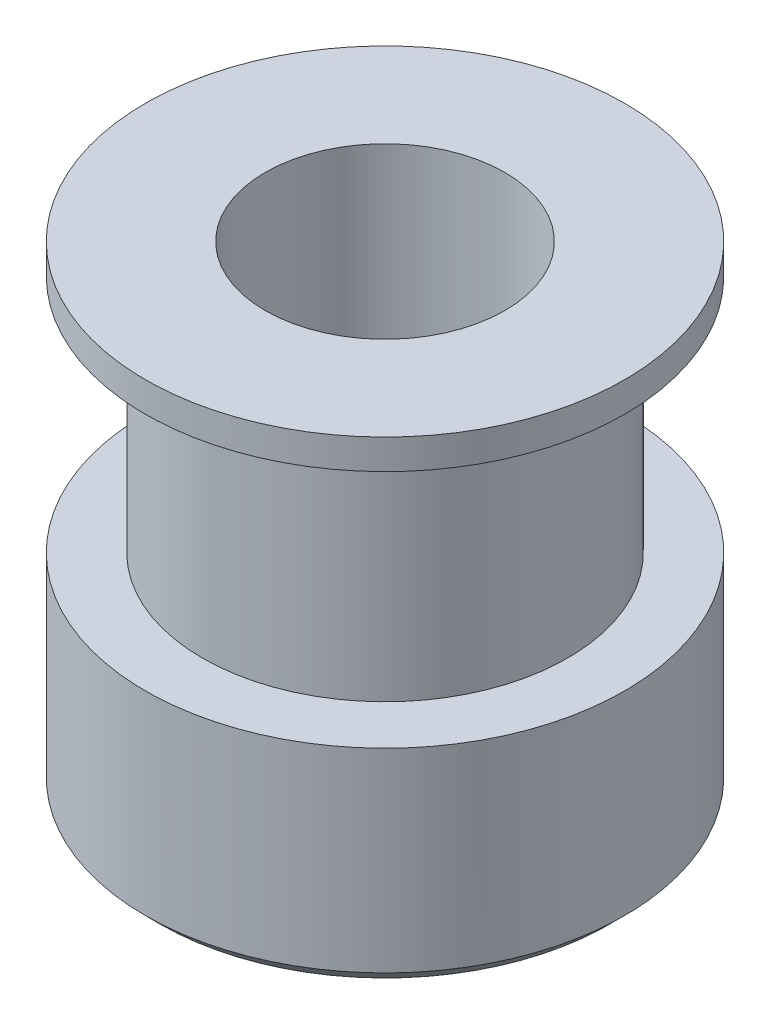
ISO-10303-21;
HEADER;
FILE_DESCRIPTION(('STEP AP214'),'2;1');
FILE_NAME('part.step','',(''),(''),'','','');
FILE_SCHEMA(('AUTOMOTIVE_DESIGN { 1 0 10303 214 1 1 1 1 }'));
ENDSEC;
DATA;
#1=APPLICATION_CONTEXT('core data for automotive mechanical design processes');
#2=APPLICATION_PROTOCOL_DEFINITION('international standard','automotive_design',2000,#1);
#3=PRODUCT_CONTEXT('',#1,'mechanical');
#4=PRODUCT('Part','Part','',(#3));
#5=PRODUCT_RELATED_PRODUCT_CATEGORY('part','',(#4));
#6=PRODUCT_DEFINITION_FORMATION('','',#4);
#7=PRODUCT_DEFINITION_CONTEXT('part definition',#1,'design');
#8=PRODUCT_DEFINITION('design','',#6,#7);
#9=PRODUCT_DEFINITION_SHAPE('','',#8);
#10=(LENGTH_UNIT() NAMED_UNIT(*) SI_UNIT(.MILLI.,.METRE.));
#11=(NAMED_UNIT(*) PLANE_ANGLE_UNIT() SI_UNIT($,.RADIAN.));
#12=(NAMED_UNIT(*) SI_UNIT($,.STERADIAN.) SOLID_ANGLE_UNIT());
#13=UNCERTAINTY_MEASURE_WITH_UNIT(LENGTH_MEASURE(1.E-05),#10,'distance_accuracy_value','');
#14=(GEOMETRIC_REPRESENTATION_CONTEXT(3) GLOBAL_UNCERTAINTY_ASSIGNED_CONTEXT((#13)) GLOBAL_UNIT_ASSIGNED_CONTEXT((#10,
#11,#12)) REPRESENTATION_CONTEXT('',''));
#15=CARTESIAN_POINT('',(0.,0.,0.));
#16=DIRECTION('',(0.,0.,1.));
#17=DIRECTION('',(1.,0.,0.));
#18=AXIS2_PLACEMENT_3D('',#15,#16,#17);
#19=CARTESIAN_POINT('',(-8.,0.,0.));
#20=DIRECTION('',(0.,1.,0.));
#21=DIRECTION('',(0.,0.,1.));
#22=AXIS2_PLACEMENT_3D('',#19,#20,#21);
#23=PLANE('',#22);
#24=CARTESIAN_POINT('',(0.,0.,0.));
#25=DIRECTION('',(0.,1.,0.));
#26=DIRECTION('',(0.,0.,1.));
#27=AXIS2_PLACEMENT_3D('',#24,#25,#26);
#28=CIRCLE('',#27,7.50000000000001);
#29=CARTESIAN_POINT('',(0.,0.,7.50000000000001));
#30=VERTEX_POINT('',#29);
#31=EDGE_CURVE('E37',#30,#30,#28,.F.);
#32=ORIENTED_EDGE('',*,*,#31,.T.);
#33=EDGE_LOOP('',(#32));
#34=FACE_BOUND('',#33,.T.);
#35=CARTESIAN_POINT('',(0.,0.,0.));
#36=DIRECTION('',(0.,-1.,0.));
#37=DIRECTION('',(0.,0.,-1.));
#38=AXIS2_PLACEMENT_3D('',#35,#36,#37);
#39=CIRCLE('',#38,4.);
#40=CARTESIAN_POINT('',(0.,0.,-4.));
#41=VERTEX_POINT('',#40);
#42=EDGE_CURVE('E41',#41,#41,#39,.T.);
#43=ORIENTED_EDGE('',*,*,#42,.F.);
#44=EDGE_LOOP('',(#43));
#45=FACE_BOUND('',#44,.T.);
#46=ADVANCED_FACE('F30',(#34,#45),#23,.F.);
#47=CARTESIAN_POINT('',(0.,0.,0.));
#48=DIRECTION('',(0.,-1.,0.));
#49=DIRECTION('',(0.,0.,-1.));
#50=AXIS2_PLACEMENT_3D('',#47,#48,#49);
#51=CYLINDRICAL_SURFACE('',#50,4.);
#52=CARTESIAN_POINT('',(-3.70809924354783,3.5,-1.5));
#53=CARTESIAN_POINT('',(-3.70809640633806,3.58100748372079,-1.50000304106109));
#54=CARTESIAN_POINT('',(-3.71078260240986,3.66199492250364,-1.49341597549487));
#55=CARTESIAN_POINT('',(-3.72116159304967,3.8215280829132,-1.46736187895468));
#56=CARTESIAN_POINT('',(-3.72885423767112,3.90007387759501,-1.44789523373263));
#57=CARTESIAN_POINT('',(-3.748254802809,4.05237537161353,-1.39689657610574));
#58=CARTESIAN_POINT('',(-3.7599530956926,4.12614205665108,-1.36539347266348));
#59=CARTESIAN_POINT('',(-3.78603134206598,4.26737189681884,-1.29131856742698));
#60=CARTESIAN_POINT('',(-3.80041210067323,4.33483315028252,-1.24874344095039));
#61=CARTESIAN_POINT('',(-3.83103574665713,4.46489031162282,-1.15146661374162));
#62=CARTESIAN_POINT('',(-3.84733341923603,4.52712852962939,-1.09630381213306));
#63=CARTESIAN_POINT('',(-3.87949750628547,4.64172281467149,-0.976395839778925));
#64=CARTESIAN_POINT('',(-3.89536382814785,4.69407677374185,-0.911648630256679));
#65=CARTESIAN_POINT('',(-3.92552873936553,4.78913951229561,-0.7716946551776));
#66=CARTESIAN_POINT('',(-3.93975561223505,4.83145947471586,-0.696206947538027));
#67=CARTESIAN_POINT('',(-3.96438007973848,4.90265117252491,-0.538555771965246));
#68=CARTESIAN_POINT('',(-3.97477900217006,4.93152757199197,-0.456394630933535));
#69=CARTESIAN_POINT('',(-3.9901869710344,4.97375789577462,-0.291489341676831));
#70=CARTESIAN_POINT('',(-3.99540915214774,4.98772762744046,-0.208923197281595));
#71=CARTESIAN_POINT('',(-4.0006401410794,5.00172120094499,-0.042464363794785));
#72=CARTESIAN_POINT('',(-4.00065064414902,5.00174957761871,0.0414278850628338));
#73=CARTESIAN_POINT('',(-3.99559265903894,4.98821823853483,0.203743543064477));
#74=CARTESIAN_POINT('',(-3.99077541996683,4.97533070205118,0.282232178266901));
#75=CARTESIAN_POINT('',(-3.97693274932263,4.93746408477445,0.435839217984392));
#76=CARTESIAN_POINT('',(-3.96790701975577,4.91248414773796,0.510957383430299));
#77=CARTESIAN_POINT('',(-3.9463776916753,4.85082954832415,0.656989017303105));
#78=CARTESIAN_POINT('',(-3.93382539470077,4.81398999473159,0.72782539228731));
#79=CARTESIAN_POINT('',(-3.90651310225279,4.72980790307061,0.86248660795756));
#80=CARTESIAN_POINT('',(-3.8917523951284,4.6824619769824,0.926309176932323));
#81=CARTESIAN_POINT('',(-3.86052529655816,4.57537271371681,1.04909048680094));
#82=CARTESIAN_POINT('',(-3.84400963763883,4.51506608434957,1.10754614526348));
#83=CARTESIAN_POINT('',(-3.81182460645722,4.38540700667844,1.21370395569342));
#84=CARTESIAN_POINT('',(-3.79615544748847,4.31605229341336,1.261403406929));
#85=CARTESIAN_POINT('',(-3.76712703500335,4.16828053253717,1.34565611808152));
#86=CARTESIAN_POINT('',(-3.75382677150277,4.08969650631393,1.38193847851831));
#87=CARTESIAN_POINT('',(-3.73172438629002,3.92690377483242,1.44056464441501));
#88=CARTESIAN_POINT('',(-3.72291976205783,3.84269822840631,1.46291620605595));
#89=CARTESIAN_POINT('',(-3.71139597222848,3.67602403768404,1.49190191709668));
#90=CARTESIAN_POINT('',(-3.70836785241537,3.59371589446386,1.49933521158966));
#91=CARTESIAN_POINT('',(-3.70786539525016,3.42899064325826,1.50057885636272));
#92=CARTESIAN_POINT('',(-3.71038967003987,3.34657356764753,1.49439261093762));
#93=CARTESIAN_POINT('',(-3.72039381629735,3.18807007771232,1.46929733520157));
#94=CARTESIAN_POINT('',(-3.72763276216449,3.11186886423534,1.45100618334225));
#95=CARTESIAN_POINT('',(-3.74596487046362,2.9636520552798,1.40299774640637));
#96=CARTESIAN_POINT('',(-3.75705882250173,2.89163732083186,1.37327812034623));
#97=CARTESIAN_POINT('',(-3.7823624311608,2.75083556192379,1.30200292275278));
#98=CARTESIAN_POINT('',(-3.79667328892065,2.68227070786266,1.26004545177047));
#99=CARTESIAN_POINT('',(-3.82662814294291,2.55287101827396,1.16591317862479));
#100=CARTESIAN_POINT('',(-3.84227262594077,2.49203902537537,1.11373463696435));
#101=CARTESIAN_POINT('',(-3.87433046553184,2.3758316268049,0.996727340900938));
#102=CARTESIAN_POINT('',(-3.89072969357028,2.32104659123125,0.931306341491061));
#103=CARTESIAN_POINT('',(-3.92149874963302,2.22316163241056,0.79179747175315));
#104=CARTESIAN_POINT('',(-3.93586857107664,2.18006174705416,0.717709573322673));
#105=CARTESIAN_POINT('',(-3.96094985704552,2.10705394380039,0.563016329468476));
#106=CARTESIAN_POINT('',(-3.9716738133801,2.0771008762074,0.482434433064626));
#107=CARTESIAN_POINT('',(-3.98829436712571,2.03134358615008,0.316881887523254));
#108=CARTESIAN_POINT('',(-3.99419323299412,2.0155327145776,0.231913320723592));
#109=CARTESIAN_POINT('',(-4.00028407317073,1.99922559724517,0.0653355852738148));
#110=CARTESIAN_POINT('',(-4.00078860953764,1.99789051694101,-0.0161807680608461));
#111=CARTESIAN_POINT('',(-3.99684889809223,2.00841515944539,-0.178226786412425));
#112=CARTESIAN_POINT('',(-3.9924052471313,2.02027329088586,-0.258756569245258));
#113=CARTESIAN_POINT('',(-3.97921089603771,2.05625885149362,-0.414548248377127));
#114=CARTESIAN_POINT('',(-3.97056791378017,2.08007990587836,-0.489890731068835));
#115=CARTESIAN_POINT('',(-3.9498778362099,2.13901001338436,-0.63551547300639));
#116=CARTESIAN_POINT('',(-3.93783009655664,2.17412120330475,-0.705796771275543));
#117=CARTESIAN_POINT('',(-3.91090618300074,2.25631394350481,-0.842540176994413));
#118=CARTESIAN_POINT('',(-3.89593240108828,2.30383664051415,-0.90871754884685));
#119=CARTESIAN_POINT('',(-3.86499507694844,2.4088078301876,-1.03241734752336));
#120=CARTESIAN_POINT('',(-3.84903118274027,2.46625986580787,-1.0899366712559));
#121=CARTESIAN_POINT('',(-3.81688129739175,2.59306413164506,-1.19781214236196));
#122=CARTESIAN_POINT('',(-3.8007280534916,2.66288440215431,-1.24762999816025));
#123=CARTESIAN_POINT('',(-3.77098325003638,2.81041586957332,-1.33484709556843));
#124=CARTESIAN_POINT('',(-3.75739195631216,2.88812788405348,-1.37224504878157));
#125=CARTESIAN_POINT('',(-3.73402269853266,3.0529556809754,-1.4346588697426));
#126=CARTESIAN_POINT('',(-3.7244380329086,3.14033436651178,-1.45906002899523));
#127=CARTESIAN_POINT('',(-3.71147994336315,3.31848527195579,-1.49172356722079));
#128=CARTESIAN_POINT('',(-3.70810242179736,3.40925521270999,-1.49999659339571));
#129=CARTESIAN_POINT('',(-3.70809924354783,3.5,-1.5));
#130=B_SPLINE_CURVE_WITH_KNOTS('',3,(#52,#53,#54,#55,#56,#57,#58,#59,#60,#61,#62,#63,#64,#65,
#66,#67,#68,#69,#70,#71,#72,#73,#74,#75,#76,#77,#78,#79,#80,#81,#82,#83,#84,#85,#86,#87,#88,#89,
#90,#91,#92,#93,#94,#95,#96,#97,#98,#99,#100,#101,#102,#103,#104,#105,#106,#107,#108,#109,#110,
#111,#112,#113,#114,#115,#116,#117,#118,#119,#120,#121,#122,#123,#124,#125,#126,#127,#128,#129),
.UNSPECIFIED.,.T.,.F.,(4,2,2,2,2,2,2,2,2,2,2,2,2,2,2,2,2,2,2,2,2,2,2,2,2,2,2,2,2,2,2,2,2,2,2,2,
2,2,4),(0.,0.242684541416171,0.485361814598855,0.72745985675703,0.969630679682933,
1.22274652401128,1.47591628822983,1.73770072136421,1.9993942638133,2.24980018489679,
2.50012465404857,2.73806472803194,2.97602165263335,3.21744131210668,3.45893893628976,
3.71456675065875,3.97025867827335,4.23162592252967,4.49284751635474,4.73965657740485,
4.98640395388884,5.22143845928199,5.45652113429526,5.70041561005822,5.94439948466355,
6.20385016993624,6.46330169650178,6.72185508890168,6.98028685560127,7.22365720549936,
7.4669982031948,7.70440274003891,7.94185223512831,8.18928323676987,8.43680270894965,
8.69738599542079,8.95799630544242,9.23003178870926,9.50188762323053),.UNSPECIFIED.);
#131=CARTESIAN_POINT('',(-3.70809924354783,3.5,-1.5));
#132=VERTEX_POINT('',#131);
#133=EDGE_CURVE('E95',#132,#132,#130,.T.);
#134=ORIENTED_EDGE('',*,*,#133,.F.);
#135=EDGE_LOOP('',(#134));
#136=FACE_BOUND('',#135,.T.);
#137=CARTESIAN_POINT('',(1.5,3.5,-3.70809924354783));
#138=CARTESIAN_POINT('',(1.50000304106109,3.58100748372079,-3.70809640633806));
#139=CARTESIAN_POINT('',(1.49341597549487,3.66199492250364,-3.71078260240986));
#140=CARTESIAN_POINT('',(1.46736187895468,3.8215280829132,-3.72116159304967));
#141=CARTESIAN_POINT('',(1.44789523373263,3.90007387759501,-3.72885423767112));
#142=CARTESIAN_POINT('',(1.39689657610574,4.05237537161353,-3.748254802809));
#143=CARTESIAN_POINT('',(1.36539347266348,4.12614205665108,-3.7599530956926));
#144=CARTESIAN_POINT('',(1.29131856742698,4.26737189681884,-3.78603134206598));
#145=CARTESIAN_POINT('',(1.24874344095039,4.33483315028252,-3.80041210067323));
#146=CARTESIAN_POINT('',(1.15146661374162,4.46489031162282,-3.83103574665713));
#147=CARTESIAN_POINT('',(1.09630381213306,4.52712852962939,-3.84733341923603));
#148=CARTESIAN_POINT('',(0.976395839778926,4.64172281467149,-3.87949750628547));
#149=CARTESIAN_POINT('',(0.911648630256679,4.69407677374186,-3.89536382814785));
#150=CARTESIAN_POINT('',(0.7716946551776,4.78913951229561,-3.92552873936553));
#151=CARTESIAN_POINT('',(0.696206947538027,4.83145947471586,-3.93975561223505));
#152=CARTESIAN_POINT('',(0.538555771965246,4.90265117252491,-3.96438007973848));
#153=CARTESIAN_POINT('',(0.456394630933535,4.93152757199198,-3.97477900217006));
#154=CARTESIAN_POINT('',(0.291489341676831,4.97375789577462,-3.9901869710344));
#155=CARTESIAN_POINT('',(0.208923197281595,4.98772762744046,-3.99540915214774));
#156=CARTESIAN_POINT('',(0.0424643637947852,5.00172120094499,-4.0006401410794));
#157=CARTESIAN_POINT('',(-0.0414278850628338,5.00174957761871,-4.00065064414902));
#158=CARTESIAN_POINT('',(-0.203743543064477,4.98821823853483,-3.99559265903894));
#159=CARTESIAN_POINT('',(-0.282232178266901,4.97533070205119,-3.99077541996683));
#160=CARTESIAN_POINT('',(-0.435839217984392,4.93746408477445,-3.97693274932263));
#161=CARTESIAN_POINT('',(-0.510957383430299,4.91248414773796,-3.96790701975577));
#162=CARTESIAN_POINT('',(-0.656989017303105,4.85082954832415,-3.9463776916753));
#163=CARTESIAN_POINT('',(-0.72782539228731,4.81398999473159,-3.93382539470077));
#164=CARTESIAN_POINT('',(-0.86248660795756,4.72980790307061,-3.90651310225279));
#165=CARTESIAN_POINT('',(-0.926309176932323,4.6824619769824,-3.8917523951284));
#166=CARTESIAN_POINT('',(-1.04909048680094,4.57537271371681,-3.86052529655816));
#167=CARTESIAN_POINT('',(-1.10754614526348,4.51506608434957,-3.84400963763883));
#168=CARTESIAN_POINT('',(-1.21370395569342,4.38540700667844,-3.81182460645722));
#169=CARTESIAN_POINT('',(-1.261403406929,4.31605229341336,-3.79615544748847));
#170=CARTESIAN_POINT('',(-1.34565611808152,4.16828053253718,-3.76712703500335));
#171=CARTESIAN_POINT('',(-1.38193847851831,4.08969650631393,-3.75382677150277));
#172=CARTESIAN_POINT('',(-1.44056464441501,3.92690377483243,-3.73172438629002));
#173=CARTESIAN_POINT('',(-1.46291620605595,3.84269822840631,-3.72291976205783));
#174=CARTESIAN_POINT('',(-1.49190191709668,3.67602403768405,-3.71139597222848));
#175=CARTESIAN_POINT('',(-1.49933521158966,3.59371589446386,-3.70836785241537));
#176=CARTESIAN_POINT('',(-1.50057885636272,3.42899064325826,-3.70786539525016));
#177=CARTESIAN_POINT('',(-1.49439261093762,3.34657356764753,-3.71038967003987));
#178=CARTESIAN_POINT('',(-1.46929733520157,3.18807007771232,-3.72039381629735));
#179=CARTESIAN_POINT('',(-1.45100618334224,3.11186886423534,-3.72763276216449));
#180=CARTESIAN_POINT('',(-1.40299774640637,2.96365205527981,-3.74596487046362));
#181=CARTESIAN_POINT('',(-1.37327812034623,2.89163732083186,-3.75705882250173));
#182=CARTESIAN_POINT('',(-1.30200292275278,2.75083556192379,-3.7823624311608));
#183=CARTESIAN_POINT('',(-1.26004545177047,2.68227070786266,-3.79667328892065));
#184=CARTESIAN_POINT('',(-1.16591317862479,2.55287101827396,-3.82662814294291));
#185=CARTESIAN_POINT('',(-1.11373463696434,2.49203902537537,-3.84227262594077));
#186=CARTESIAN_POINT('',(-0.996727340900936,2.3758316268049,-3.87433046553184));
#187=CARTESIAN_POINT('',(-0.93130634149106,2.32104659123125,-3.89072969357028));
#188=CARTESIAN_POINT('',(-0.791797471753149,2.22316163241056,-3.92149874963302));
#189=CARTESIAN_POINT('',(-0.717709573322671,2.18006174705416,-3.93586857107664));
#190=CARTESIAN_POINT('',(-0.563016329468475,2.10705394380039,-3.96094985704552));
#191=CARTESIAN_POINT('',(-0.482434433064625,2.0771008762074,-3.9716738133801));
#192=CARTESIAN_POINT('',(-0.316881887523253,2.03134358615008,-3.98829436712571));
#193=CARTESIAN_POINT('',(-0.231913320723591,2.0155327145776,-3.99419323299413));
#194=CARTESIAN_POINT('',(-0.0653355852738134,1.99922559724518,-4.00028407317073));
#195=CARTESIAN_POINT('',(0.0161807680608475,1.99789051694101,-4.00078860953764));
#196=CARTESIAN_POINT('',(0.178226786412426,2.0084151594454,-3.99684889809223));
#197=CARTESIAN_POINT('',(0.258756569245259,2.02027329088586,-3.9924052471313));
#198=CARTESIAN_POINT('',(0.414548248377128,2.05625885149362,-3.97921089603771));
#199=CARTESIAN_POINT('',(0.489890731068836,2.08007990587836,-3.97056791378017));
#200=CARTESIAN_POINT('',(0.635515473006392,2.13901001338436,-3.9498778362099));
#201=CARTESIAN_POINT('',(0.705796771275544,2.17412120330475,-3.93783009655664));
#202=CARTESIAN_POINT('',(0.842540176994414,2.25631394350481,-3.91090618300074));
#203=CARTESIAN_POINT('',(0.908717548846851,2.30383664051415,-3.89593240108828));
#204=CARTESIAN_POINT('',(1.03241734752336,2.40880783018761,-3.86499507694844));
#205=CARTESIAN_POINT('',(1.0899366712559,2.46625986580788,-3.84903118274027));
#206=CARTESIAN_POINT('',(1.19781214236196,2.59306413164506,-3.81688129739175));
#207=CARTESIAN_POINT('',(1.24762999816025,2.66288440215431,-3.8007280534916));
#208=CARTESIAN_POINT('',(1.33484709556843,2.81041586957333,-3.77098325003638));
#209=CARTESIAN_POINT('',(1.37224504878157,2.88812788405348,-3.75739195631216));
#210=CARTESIAN_POINT('',(1.4346588697426,3.05295568097541,-3.73402269853266));
#211=CARTESIAN_POINT('',(1.45906002899523,3.14033436651179,-3.7244380329086));
#212=CARTESIAN_POINT('',(1.49172356722079,3.31848527195579,-3.71147994336315));
#213=CARTESIAN_POINT('',(1.49999659339571,3.40925521270999,-3.70810242179736));
#214=CARTESIAN_POINT('',(1.5,3.5,-3.70809924354783));
#215=B_SPLINE_CURVE_WITH_KNOTS('',3,(#137,#138,#139,#140,#141,#142,#143,#144,#145,#146,#147,
#148,#149,#150,#151,#152,#153,#154,#155,#156,#157,#158,#159,#160,#161,#162,#163,#164,#165,#166,
#167,#168,#169,#170,#171,#172,#173,#174,#175,#176,#177,#178,#179,#180,#181,#182,#183,#184,#185,
#186,#187,#188,#189,#190,#191,#192,#193,#194,#195,#196,#197,#198,#199,#200,#201,#202,#203,#204,
#205,#206,#207,#208,#209,#210,#211,#212,#213,#214),.UNSPECIFIED.,.T.,.F.,(4,2,2,2,2,2,2,2,2,2,2,
2,2,2,2,2,2,2,2,2,2,2,2,2,2,2,2,2,2,2,2,2,2,2,2,2,2,2,4),(0.,0.242684541416171,
0.485361814598855,0.72745985675703,0.969630679682934,1.22274652401128,1.47591628822983,
1.73770072136421,1.9993942638133,2.24980018489679,2.50012465404857,2.73806472803194,
2.97602165263335,3.21744131210668,3.45893893628976,3.71456675065874,3.97025867827335,
4.23162592252966,4.49284751635474,4.73965657740485,4.98640395388884,5.22143845928199,
5.45652113429526,5.70041561005822,5.94439948466355,6.20385016993624,6.46330169650178,
6.72185508890168,6.98028685560127,7.22365720549936,7.4669982031948,7.7044027400389,
7.94185223512831,8.18928323676987,8.43680270894964,8.69738599542079,8.95799630544242,
9.23003178870926,9.50188762323053),.UNSPECIFIED.);
#216=CARTESIAN_POINT('',(1.5,3.5,-3.70809924354783));
#217=VERTEX_POINT('',#216);
#218=EDGE_CURVE('E65',#217,#217,#215,.T.);
#219=ORIENTED_EDGE('',*,*,#218,.F.);
#220=EDGE_LOOP('',(#219));
#221=FACE_BOUND('',#220,.T.);
#222=CARTESIAN_POINT('',(0.,16.,0.));
#223=DIRECTION('',(0.,-1.,0.));
#224=DIRECTION('',(0.,0.,-1.));
#225=AXIS2_PLACEMENT_3D('',#222,#223,#224);
#226=CIRCLE('',#225,4.);
#227=CARTESIAN_POINT('',(0.,16.,-4.));
#228=VERTEX_POINT('',#227);
#229=EDGE_CURVE('E45',#228,#228,#226,.T.);
#230=ORIENTED_EDGE('',*,*,#229,.F.);
#231=EDGE_LOOP('',(#230));
#232=FACE_BOUND('',#231,.T.);
#233=ORIENTED_EDGE('',*,*,#42,.T.);
#234=EDGE_LOOP('',(#233));
#235=FACE_BOUND('',#234,.T.);
#236=ADVANCED_FACE('F139',(#136,#221,#232,#235),#51,.F.);
#237=CARTESIAN_POINT('',(-4.,16.,0.));
#238=DIRECTION('',(0.,-1.,0.));
#239=DIRECTION('',(0.,0.,-1.));
#240=AXIS2_PLACEMENT_3D('',#237,#238,#239);
#241=PLANE('',#240);
#242=CARTESIAN_POINT('',(0.,16.,0.));
#243=DIRECTION('',(0.,-1.,0.));
#244=DIRECTION('',(0.,0.,-1.));
#245=AXIS2_PLACEMENT_3D('',#242,#243,#244);
#246=CIRCLE('',#245,8.);
#247=CARTESIAN_POINT('',(0.,16.,-8.));
#248=VERTEX_POINT('',#247);
#249=EDGE_CURVE('E50',#248,#248,#246,.T.);
#250=ORIENTED_EDGE('',*,*,#249,.F.);
#251=EDGE_LOOP('',(#250));
#252=FACE_BOUND('',#251,.T.);
#253=ORIENTED_EDGE('',*,*,#229,.T.);
#254=EDGE_LOOP('',(#253));
#255=FACE_BOUND('',#254,.T.);
#256=ADVANCED_FACE('F133',(#252,#255),#241,.F.);
#257=CARTESIAN_POINT('',(0.,0.,0.));
#258=DIRECTION('',(0.,-1.,0.));
#259=DIRECTION('',(0.,0.,-1.));
#260=AXIS2_PLACEMENT_3D('',#257,#258,#259);
#261=CYLINDRICAL_SURFACE('',#260,8.);
#262=CARTESIAN_POINT('',(0.,15.,0.));
#263=DIRECTION('',(0.,-1.,0.));
#264=DIRECTION('',(0.,0.,-1.));
#265=AXIS2_PLACEMENT_3D('',#262,#263,#264);
#266=CIRCLE('',#265,8.);
#267=CARTESIAN_POINT('',(0.,15.,-8.));
#268=VERTEX_POINT('',#267);
#269=EDGE_CURVE('E53',#268,#268,#266,.T.);
#270=ORIENTED_EDGE('',*,*,#269,.F.);
#271=EDGE_LOOP('',(#270));
#272=FACE_BOUND('',#271,.T.);
#273=ORIENTED_EDGE('',*,*,#249,.T.);
#274=EDGE_LOOP('',(#273));
#275=FACE_BOUND('',#274,.T.);
#276=ADVANCED_FACE('F127',(#272,#275),#261,.T.);
#277=CARTESIAN_POINT('',(-8.,15.,0.));
#278=DIRECTION('',(0.,1.,0.));
#279=DIRECTION('',(0.,0.,1.));
#280=AXIS2_PLACEMENT_3D('',#277,#278,#279);
#281=PLANE('',#280);
#282=CARTESIAN_POINT('',(0.,15.,0.));
#283=DIRECTION('',(0.,-1.,0.));
#284=DIRECTION('',(0.,0.,-1.));
#285=AXIS2_PLACEMENT_3D('',#282,#283,#284);
#286=CIRCLE('',#285,6.1);
#287=CARTESIAN_POINT('',(0.,15.,-6.1));
#288=VERTEX_POINT('',#287);
#289=EDGE_CURVE('E56',#288,#288,#286,.T.);
#290=ORIENTED_EDGE('',*,*,#289,.F.);
#291=EDGE_LOOP('',(#290));
#292=FACE_BOUND('',#291,.T.);
#293=ORIENTED_EDGE('',*,*,#269,.T.);
#294=EDGE_LOOP('',(#293));
#295=FACE_BOUND('',#294,.T.);
#296=ADVANCED_FACE('F121',(#292,#295),#281,.F.);
#297=CARTESIAN_POINT('',(0.,0.,0.));
#298=DIRECTION('',(0.,-1.,0.));
#299=DIRECTION('',(0.,0.,-1.));
#300=AXIS2_PLACEMENT_3D('',#297,#298,#299);
#301=CYLINDRICAL_SURFACE('',#300,6.1);
#302=CARTESIAN_POINT('',(0.,7.,0.));
#303=DIRECTION('',(0.,-1.,0.));
#304=DIRECTION('',(0.,0.,-1.));
#305=AXIS2_PLACEMENT_3D('',#302,#303,#304);
#306=CIRCLE('',#305,6.1);
#307=CARTESIAN_POINT('',(0.,7.,-6.1));
#308=VERTEX_POINT('',#307);
#309=EDGE_CURVE('E59',#308,#308,#306,.T.);
#310=ORIENTED_EDGE('',*,*,#309,.F.);
#311=EDGE_LOOP('',(#310));
#312=FACE_BOUND('',#311,.T.);
#313=ORIENTED_EDGE('',*,*,#289,.T.);
#314=EDGE_LOOP('',(#313));
#315=FACE_BOUND('',#314,.T.);
#316=ADVANCED_FACE('F115',(#312,#315),#301,.T.);
#317=CARTESIAN_POINT('',(-6.1,7.,0.));
#318=DIRECTION('',(0.,-1.,0.));
#319=DIRECTION('',(0.,0.,-1.));
#320=AXIS2_PLACEMENT_3D('',#317,#318,#319);
#321=PLANE('',#320);
#322=CARTESIAN_POINT('',(0.,7.,0.));
#323=DIRECTION('',(0.,-1.,0.));
#324=DIRECTION('',(0.,0.,-1.));
#325=AXIS2_PLACEMENT_3D('',#322,#323,#324);
#326=CIRCLE('',#325,8.);
#327=CARTESIAN_POINT('',(0.,7.,-8.));
#328=VERTEX_POINT('',#327);
#329=EDGE_CURVE('E62',#328,#328,#326,.T.);
#330=ORIENTED_EDGE('',*,*,#329,.F.);
#331=EDGE_LOOP('',(#330));
#332=FACE_BOUND('',#331,.T.);
#333=ORIENTED_EDGE('',*,*,#309,.T.);
#334=EDGE_LOOP('',(#333));
#335=FACE_BOUND('',#334,.T.);
#336=ADVANCED_FACE('F108',(#332,#335),#321,.F.);
#337=CARTESIAN_POINT('',(0.,0.,0.));
#338=DIRECTION('',(0.,-1.,0.));
#339=DIRECTION('',(0.,0.,-1.));
#340=AXIS2_PLACEMENT_3D('',#337,#338,#339);
#341=CYLINDRICAL_SURFACE('',#340,8.);
#342=CARTESIAN_POINT('',(-7.85811682275086,3.5,-1.5));
#343=CARTESIAN_POINT('',(-7.85811843793494,3.41654279198826,-1.49999679883246));
#344=CARTESIAN_POINT('',(-7.85946079760266,3.33304405178161,-1.49301126348936));
#345=CARTESIAN_POINT('',(-7.86467851014364,3.16840103841809,-1.46527253251805));
#346=CARTESIAN_POINT('',(-7.86855601173205,3.08725882357252,-1.44450765768477));
#347=CARTESIAN_POINT('',(-7.87838976464885,2.92973492862912,-1.38987035617788));
#348=CARTESIAN_POINT('',(-7.88434407905997,2.85334889069271,-1.35601013954374));
#349=CARTESIAN_POINT('',(-7.89765826320959,2.70734644071319,-1.27617565760366));
#350=CARTESIAN_POINT('',(-7.90501802325622,2.6377295009967,-1.23020233759193));
#351=CARTESIAN_POINT('',(-7.92041614838944,2.50636980080087,-1.12683678942622));
#352=CARTESIAN_POINT('',(-7.92846116625679,2.44472351652827,-1.06932292933092));
#353=CARTESIAN_POINT('',(-7.94426457664034,2.33189561040043,-0.944771778803551));
#354=CARTESIAN_POINT('',(-7.95202295031153,2.2807146755752,-0.877733863624944));
#355=CARTESIAN_POINT('',(-7.96645017828405,2.18990062339948,-0.735403894570162));
#356=CARTESIAN_POINT('',(-7.97311028052363,2.15035846648058,-0.660052840033865));
#357=CARTESIAN_POINT('',(-7.98451608632931,2.08453045772647,-0.503631283250762));
#358=CARTESIAN_POINT('',(-7.98926194728334,2.05824351600978,-0.422561251859506));
#359=CARTESIAN_POINT('',(-7.99625755123778,2.01997045138887,-0.258002746187416));
#360=CARTESIAN_POINT('',(-7.99853565976327,2.00782169407731,-0.174553323244857));
#361=CARTESIAN_POINT('',(-8.00043684615594,1.9976631122996,-0.00677167603538291));
#362=CARTESIAN_POINT('',(-8.00006015010697,1.99965208386094,0.0775604724476704));
#363=CARTESIAN_POINT('',(-7.99671633763241,2.01758777114715,0.243598357899397));
#364=CARTESIAN_POINT('',(-7.99378172247214,2.03335936943001,0.32532376045147));
#365=CARTESIAN_POINT('',(-7.98568826333561,2.07813564939524,0.484947165715476));
#366=CARTESIAN_POINT('',(-7.98052933829966,2.1071408133458,0.562845028826541));
#367=CARTESIAN_POINT('',(-7.96851260297339,2.1777277310583,0.713110065751521));
#368=CARTESIAN_POINT('',(-7.96164537590825,2.2193794879125,0.785443571838533));
#369=CARTESIAN_POINT('',(-7.9469714754285,2.31402566907715,0.922159977214638));
#370=CARTESIAN_POINT('',(-7.93916470651164,2.36702124688758,0.986542066910785));
#371=CARTESIAN_POINT('',(-7.92333513680567,2.48381570298353,1.10656561896904));
#372=CARTESIAN_POINT('',(-7.91531085901621,2.54776778390207,1.16205790757041));
#373=CARTESIAN_POINT('',(-7.9000650892462,2.68414953127862,1.26155171851261));
#374=CARTESIAN_POINT('',(-7.89284360901351,2.75657932176463,1.30555307271182));
#375=CARTESIAN_POINT('',(-7.88001893307121,2.90805827070266,1.38085852224478));
#376=CARTESIAN_POINT('',(-7.87441850530261,2.98711845719064,1.41214093645421));
#377=CARTESIAN_POINT('',(-7.86551242396689,3.1495011841232,1.46093656975056));
#378=CARTESIAN_POINT('',(-7.8622065103862,3.23282324046478,1.47845134901108));
#379=CARTESIAN_POINT('',(-7.85831520301005,3.40001932885588,1.49899672649739));
#380=CARTESIAN_POINT('',(-7.85768955816136,3.48386611556551,1.50224164285859));
#381=CARTESIAN_POINT('',(-7.8591219142084,3.65090345508715,1.49472968881724));
#382=CARTESIAN_POINT('',(-7.86117978238611,3.73409404014808,1.48397351086433));
#383=CARTESIAN_POINT('',(-7.86770980063205,3.89675290305439,1.44894868195883));
#384=CARTESIAN_POINT('',(-7.87216186690878,3.97624625262489,1.4247923858399));
#385=CARTESIAN_POINT('',(-7.88296134156618,4.13005718973016,1.3637722437906));
#386=CARTESIAN_POINT('',(-7.88930888963281,4.20437439531533,1.32690746128795));
#387=CARTESIAN_POINT('',(-7.90327577863685,4.34666761904317,1.2410235311966));
#388=CARTESIAN_POINT('',(-7.91090895425315,4.41456053786607,1.19186899639621));
#389=CARTESIAN_POINT('',(-7.926548113681,4.54121204021433,1.08298344344247));
#390=CARTESIAN_POINT('',(-7.93455413096494,4.59996980155577,1.02325147433084));
#391=CARTESIAN_POINT('',(-7.95016624005946,4.70748376353412,0.893949417870385));
#392=CARTESIAN_POINT('',(-7.95776555833305,4.75609582660596,0.82425853409589));
#393=CARTESIAN_POINT('',(-7.97159404810351,4.84092120617766,0.67757452304014));
#394=CARTESIAN_POINT('',(-7.97782327234725,4.877135000025,0.600581677038528));
#395=CARTESIAN_POINT('',(-7.98818057995848,4.93592009786408,0.441877541578684));
#396=CARTESIAN_POINT('',(-7.99231954730142,4.95856218756141,0.360193213078988));
#397=CARTESIAN_POINT('',(-7.99807642083745,4.98978704828988,0.194096227381571));
#398=CARTESIAN_POINT('',(-7.99969459229933,4.99837129866271,0.109683858215851));
#399=CARTESIAN_POINT('',(-8.00022227515441,5.00118530151844,-0.058090760250509));
#400=CARTESIAN_POINT('',(-7.99917286625032,4.99563275312953,-0.141449307066268));
#401=CARTESIAN_POINT('',(-7.99456866611703,4.97080757223156,-0.306023369279199));
#402=CARTESIAN_POINT('',(-7.99101389890671,4.95153507125579,-0.387238905213689));
#403=CARTESIAN_POINT('',(-7.98179837978045,4.89990879261628,-0.545106475595485));
#404=CARTESIAN_POINT('',(-7.97614135981576,4.86757818711899,-0.621766319318223));
#405=CARTESIAN_POINT('',(-7.96333372068771,4.79077954634482,-0.768605631316694));
#406=CARTESIAN_POINT('',(-7.95618300146483,4.74631069789335,-0.838784665003271));
#407=CARTESIAN_POINT('',(-7.94104779859941,4.64574854555768,-0.971755027780007));
#408=CARTESIAN_POINT('',(-7.93305284591272,4.58949796613829,-1.03442623539053));
#409=CARTESIAN_POINT('',(-7.91719633538833,4.46729543750729,-1.14951536065485));
#410=CARTESIAN_POINT('',(-7.90933480936765,4.40134120962628,-1.2019308632478));
#411=CARTESIAN_POINT('',(-7.89455577425926,4.26087354529665,-1.29547633945385));
#412=CARTESIAN_POINT('',(-7.88764767280729,4.18628656033236,-1.33649740531872));
#413=CARTESIAN_POINT('',(-7.87567084650033,4.03117421002026,-1.40536132423417));
#414=CARTESIAN_POINT('',(-7.87060038649116,3.95065453341062,-1.43321661638912));
#415=CARTESIAN_POINT('',(-7.86393016292125,3.80824771193408,-1.46929726596175));
#416=CARTESIAN_POINT('',(-7.86176310717932,3.74719427623805,-1.4807910573985));
#417=CARTESIAN_POINT('',(-7.85885585595504,3.62410153157968,-1.49614351076215));
#418=CARTESIAN_POINT('',(-7.85811562163282,3.56206224949967,-1.50000238052127));
#419=CARTESIAN_POINT('',(-7.85811682275086,3.5,-1.5));
#420=B_SPLINE_CURVE_WITH_KNOTS('',3,(#342,#343,#344,#345,#346,#347,#348,#349,#350,#351,#352,
#353,#354,#355,#356,#357,#358,#359,#360,#361,#362,#363,#364,#365,#366,#367,#368,#369,#370,#371,
#372,#373,#374,#375,#376,#377,#378,#379,#380,#381,#382,#383,#384,#385,#386,#387,#388,#389,#390,
#391,#392,#393,#394,#395,#396,#397,#398,#399,#400,#401,#402,#403,#404,#405,#406,#407,#408,#409,
#410,#411,#412,#413,#414,#415,#416,#417,#418,#419),.UNSPECIFIED.,.T.,.F.,(4,2,2,2,2,2,2,2,2,2,2,
2,2,2,2,2,2,2,2,2,2,2,2,2,2,2,2,2,2,2,2,2,2,2,2,2,2,2,4),(0.,0.250144505793187,
0.500501302380393,0.750625227978432,1.00072963993908,1.25362335698691,1.50653367069315,
1.76137104348047,2.0161874593964,2.26804275460261,2.51987660200648,2.76855650598725,
3.01724547328425,3.26733691984219,3.51745380911785,3.77140614764064,4.025362201924,
4.27974936118266,4.53410768866488,4.78463248587075,5.03514489338718,5.28358792315368,
5.53204926624317,5.78337862654143,6.03473059394677,6.28944125495871,6.54414210821705,
6.79750269418683,7.0508366166733,7.30029300570138,7.54974700322167,7.79876026530358,
8.0477902135711,8.30038464008745,8.55303847730765,8.80803001818118,9.06278015749119,
9.24880307527215,9.43482092920425),.UNSPECIFIED.);
#421=CARTESIAN_POINT('',(-7.85811682275086,3.5,-1.5));
#422=VERTEX_POINT('',#421);
#423=EDGE_CURVE('E92',#422,#422,#420,.T.);
#424=ORIENTED_EDGE('',*,*,#423,.F.);
#425=EDGE_LOOP('',(#424));
#426=FACE_BOUND('',#425,.T.);
#427=CARTESIAN_POINT('',(1.5,3.5,-7.85811682275086));
#428=CARTESIAN_POINT('',(1.49999679883246,3.41654279198826,-7.85811843793493));
#429=CARTESIAN_POINT('',(1.49301126348936,3.33304405178161,-7.85946079760266));
#430=CARTESIAN_POINT('',(1.46527253251805,3.16840103841809,-7.86467851014364));
#431=CARTESIAN_POINT('',(1.44450765768477,3.08725882357252,-7.86855601173205));
#432=CARTESIAN_POINT('',(1.38987035617788,2.92973492862913,-7.87838976464885));
#433=CARTESIAN_POINT('',(1.35601013954374,2.85334889069271,-7.88434407905997));
#434=CARTESIAN_POINT('',(1.27617565760366,2.70734644071319,-7.89765826320959));
#435=CARTESIAN_POINT('',(1.23020233759193,2.6377295009967,-7.90501802325622));
#436=CARTESIAN_POINT('',(1.12683678942622,2.50636980080087,-7.92041614838944));
#437=CARTESIAN_POINT('',(1.06932292933092,2.44472351652827,-7.92846116625679));
#438=CARTESIAN_POINT('',(0.944771778803551,2.33189561040044,-7.94426457664034));
#439=CARTESIAN_POINT('',(0.877733863624945,2.28071467557521,-7.95202295031153));
#440=CARTESIAN_POINT('',(0.735403894570163,2.18990062339948,-7.96645017828405));
#441=CARTESIAN_POINT('',(0.660052840033866,2.15035846648058,-7.97311028052363));
#442=CARTESIAN_POINT('',(0.503631283250762,2.08453045772647,-7.98451608632931));
#443=CARTESIAN_POINT('',(0.422561251859506,2.05824351600978,-7.98926194728334));
#444=CARTESIAN_POINT('',(0.258002746187416,2.01997045138887,-7.99625755123778));
#445=CARTESIAN_POINT('',(0.174553323244857,2.00782169407732,-7.99853565976327));
#446=CARTESIAN_POINT('',(0.00677167603538354,1.9976631122996,-8.00043684615594));
#447=CARTESIAN_POINT('',(-0.0775604724476698,1.99965208386094,-8.00006015010697));
#448=CARTESIAN_POINT('',(-0.243598357899396,2.01758777114715,-7.99671633763241));
#449=CARTESIAN_POINT('',(-0.325323760451469,2.03335936943001,-7.99378172247214));
#450=CARTESIAN_POINT('',(-0.484947165715475,2.07813564939524,-7.98568826333561));
#451=CARTESIAN_POINT('',(-0.56284502882654,2.1071408133458,-7.98052933829966));
#452=CARTESIAN_POINT('',(-0.713110065751521,2.1777277310583,-7.96851260297339));
#453=CARTESIAN_POINT('',(-0.785443571838532,2.2193794879125,-7.96164537590825));
#454=CARTESIAN_POINT('',(-0.922159977214637,2.31402566907715,-7.9469714754285));
#455=CARTESIAN_POINT('',(-0.986542066910784,2.36702124688758,-7.93916470651164));
#456=CARTESIAN_POINT('',(-1.10656561896904,2.48381570298353,-7.92333513680567));
#457=CARTESIAN_POINT('',(-1.16205790757041,2.54776778390207,-7.91531085901621));
#458=CARTESIAN_POINT('',(-1.2615517185126,2.68414953127862,-7.90006508924621));
#459=CARTESIAN_POINT('',(-1.30555307271182,2.75657932176463,-7.89284360901351));
#460=CARTESIAN_POINT('',(-1.38085852224478,2.90805827070266,-7.88001893307122));
#461=CARTESIAN_POINT('',(-1.41214093645421,2.98711845719064,-7.87441850530261));
#462=CARTESIAN_POINT('',(-1.46093656975056,3.1495011841232,-7.86551242396689));
#463=CARTESIAN_POINT('',(-1.47845134901108,3.23282324046478,-7.8622065103862));
#464=CARTESIAN_POINT('',(-1.49899672649739,3.40001932885588,-7.85831520301005));
#465=CARTESIAN_POINT('',(-1.50224164285859,3.48386611556551,-7.85768955816137));
#466=CARTESIAN_POINT('',(-1.49472968881724,3.65090345508715,-7.8591219142084));
#467=CARTESIAN_POINT('',(-1.48397351086433,3.73409404014808,-7.86117978238611));
#468=CARTESIAN_POINT('',(-1.44894868195883,3.89675290305439,-7.86770980063205));
#469=CARTESIAN_POINT('',(-1.4247923858399,3.9762462526249,-7.87216186690878));
#470=CARTESIAN_POINT('',(-1.3637722437906,4.13005718973016,-7.88296134156619));
#471=CARTESIAN_POINT('',(-1.32690746128795,4.20437439531533,-7.88930888963281));
#472=CARTESIAN_POINT('',(-1.2410235311966,4.34666761904317,-7.90327577863685));
#473=CARTESIAN_POINT('',(-1.19186899639621,4.41456053786607,-7.91090895425315));
#474=CARTESIAN_POINT('',(-1.08298344344247,4.54121204021433,-7.926548113681));
#475=CARTESIAN_POINT('',(-1.02325147433084,4.59996980155577,-7.93455413096494));
#476=CARTESIAN_POINT('',(-0.893949417870385,4.70748376353413,-7.95016624005946));
#477=CARTESIAN_POINT('',(-0.824258534095891,4.75609582660597,-7.95776555833305));
#478=CARTESIAN_POINT('',(-0.67757452304014,4.84092120617766,-7.97159404810351));
#479=CARTESIAN_POINT('',(-0.600581677038528,4.87713500002501,-7.97782327234725));
#480=CARTESIAN_POINT('',(-0.441877541578684,4.93592009786408,-7.98818057995848));
#481=CARTESIAN_POINT('',(-0.360193213078988,4.95856218756141,-7.99231954730142));
#482=CARTESIAN_POINT('',(-0.194096227381571,4.98978704828989,-7.99807642083745));
#483=CARTESIAN_POINT('',(-0.109683858215851,4.99837129866271,-7.99969459229933));
#484=CARTESIAN_POINT('',(0.0580907602505086,5.00118530151844,-8.00022227515441));
#485=CARTESIAN_POINT('',(0.141449307066267,4.99563275312953,-7.99917286625032));
#486=CARTESIAN_POINT('',(0.306023369279199,4.97080757223157,-7.99456866611703));
#487=CARTESIAN_POINT('',(0.387238905213689,4.95153507125579,-7.99101389890671));
#488=CARTESIAN_POINT('',(0.545106475595484,4.89990879261628,-7.98179837978045));
#489=CARTESIAN_POINT('',(0.621766319318223,4.86757818711899,-7.97614135981576));
#490=CARTESIAN_POINT('',(0.768605631316694,4.79077954634482,-7.96333372068771));
#491=CARTESIAN_POINT('',(0.83878466500327,4.74631069789335,-7.95618300146483));
#492=CARTESIAN_POINT('',(0.971755027780006,4.64574854555768,-7.94104779859941));
#493=CARTESIAN_POINT('',(1.03442623539053,4.5894979661383,-7.93305284591272));
#494=CARTESIAN_POINT('',(1.14951536065485,4.46729543750729,-7.91719633538833));
#495=CARTESIAN_POINT('',(1.2019308632478,4.40134120962628,-7.90933480936765));
#496=CARTESIAN_POINT('',(1.29547633945385,4.26087354529666,-7.89455577425926));
#497=CARTESIAN_POINT('',(1.33649740531872,4.18628656033236,-7.88764767280729));
#498=CARTESIAN_POINT('',(1.40536132423417,4.03117421002026,-7.87567084650033));
#499=CARTESIAN_POINT('',(1.43321661638912,3.95065453341062,-7.87060038649116));
#500=CARTESIAN_POINT('',(1.46929726596175,3.80824771193409,-7.86393016292125));
#501=CARTESIAN_POINT('',(1.48079105739851,3.74719427623806,-7.86176310717932));
#502=CARTESIAN_POINT('',(1.49614351076215,3.62410153157969,-7.85885585595504));
#503=CARTESIAN_POINT('',(1.50000238052127,3.56206224949967,-7.85811562163283));
#504=CARTESIAN_POINT('',(1.5,3.5,-7.85811682275086));
#505=B_SPLINE_CURVE_WITH_KNOTS('',3,(#427,#428,#429,#430,#431,#432,#433,#434,#435,#436,#437,
#438,#439,#440,#441,#442,#443,#444,#445,#446,#447,#448,#449,#450,#451,#452,#453,#454,#455,#456,
#457,#458,#459,#460,#461,#462,#463,#464,#465,#466,#467,#468,#469,#470,#471,#472,#473,#474,#475,
#476,#477,#478,#479,#480,#481,#482,#483,#484,#485,#486,#487,#488,#489,#490,#491,#492,#493,#494,
#495,#496,#497,#498,#499,#500,#501,#502,#503,#504),.UNSPECIFIED.,.T.,.F.,(4,2,2,2,2,2,2,2,2,2,2,
2,2,2,2,2,2,2,2,2,2,2,2,2,2,2,2,2,2,2,2,2,2,2,2,2,2,2,4),(0.,0.250144505793187,
0.500501302380393,0.750625227978432,1.00072963993908,1.25362335698691,1.50653367069315,
1.76137104348047,2.0161874593964,2.26804275460261,2.51987660200648,2.76855650598725,
3.01724547328425,3.26733691984219,3.51745380911785,3.77140614764064,4.025362201924,
4.27974936118266,4.53410768866487,4.78463248587075,5.03514489338718,5.28358792315368,
5.53204926624317,5.78337862654143,6.03473059394677,6.2894412549587,6.54414210821705,
6.79750269418683,7.0508366166733,7.30029300570138,7.54974700322167,7.79876026530358,
8.0477902135711,8.30038464008745,8.55303847730765,8.80803001818118,9.06278015749119,
9.24880307527215,9.43482092920425),.UNSPECIFIED.);
#506=CARTESIAN_POINT('',(1.5,3.5,-7.85811682275086));
#507=VERTEX_POINT('',#506);
#508=EDGE_CURVE('E72',#507,#507,#505,.T.);
#509=ORIENTED_EDGE('',*,*,#508,.F.);
#510=EDGE_LOOP('',(#509));
#511=FACE_BOUND('',#510,.T.);
#512=CARTESIAN_POINT('',(0.,0.499999999999996,0.));
#513=DIRECTION('',(0.,1.,0.));
#514=DIRECTION('',(0.,0.,1.));
#515=AXIS2_PLACEMENT_3D('',#512,#513,#514);
#516=CIRCLE('',#515,8.);
#517=CARTESIAN_POINT('',(0.,0.499999999999996,8.));
#518=VERTEX_POINT('',#517);
#519=EDGE_CURVE('E10',#518,#518,#516,.T.);
#520=ORIENTED_EDGE('',*,*,#519,.T.);
#521=EDGE_LOOP('',(#520));
#522=FACE_BOUND('',#521,.T.);
#523=ORIENTED_EDGE('',*,*,#329,.T.);
#524=EDGE_LOOP('',(#523));
#525=FACE_BOUND('',#524,.T.);
#526=ADVANCED_FACE('F105',(#426,#511,#522,#525),#341,.T.);
#527=CARTESIAN_POINT('',(0.,0.,0.));
#528=DIRECTION('',(0.,1.,0.));
#529=DIRECTION('',(0.,0.,1.));
#530=AXIS2_PLACEMENT_3D('',#527,#528,#529);
#531=CONICAL_SURFACE('',#530,7.50000000000001,0.785398163397445);
#532=ORIENTED_EDGE('',*,*,#519,.F.);
#533=EDGE_LOOP('',(#532));
#534=FACE_BOUND('',#533,.T.);
#535=ORIENTED_EDGE('',*,*,#31,.F.);
#536=EDGE_LOOP('',(#535));
#537=FACE_BOUND('',#536,.T.);
#538=ADVANCED_FACE('F32',(#534,#537),#531,.T.);
#539=CARTESIAN_POINT('',(0.,3.5,-8.001));
#540=DIRECTION('',(0.,0.,1.));
#541=DIRECTION('',(1.,0.,0.));
#542=AXIS2_PLACEMENT_3D('',#539,#540,#541);
#543=CYLINDRICAL_SURFACE('',#542,1.5);
#544=ORIENTED_EDGE('',*,*,#508,.T.);
#545=EDGE_LOOP('',(#544));
#546=FACE_BOUND('',#545,.T.);
#547=ORIENTED_EDGE('',*,*,#218,.T.);
#548=EDGE_LOOP('',(#547));
#549=FACE_BOUND('',#548,.T.);
#550=ADVANCED_FACE('F77',(#546,#549),#543,.F.);
#551=CARTESIAN_POINT('',(-8.001,3.5,0.));
#552=DIRECTION('',(1.,0.,0.));
#553=DIRECTION('',(0.,0.,-1.));
#554=AXIS2_PLACEMENT_3D('',#551,#552,#553);
#555=CYLINDRICAL_SURFACE('',#554,1.5);
#556=ORIENTED_EDGE('',*,*,#423,.T.);
#557=EDGE_LOOP('',(#556));
#558=FACE_BOUND('',#557,.T.);
#559=ORIENTED_EDGE('',*,*,#133,.T.);
#560=EDGE_LOOP('',(#559));
#561=FACE_BOUND('',#560,.T.);
#562=ADVANCED_FACE('F83',(#558,#561),#555,.F.);
#563=CLOSED_SHELL('',(#46,#236,#256,#276,#296,#316,#336,#526,#538,#550,#562));
#564=MANIFOLD_SOLID_BREP('B2',#563);
#565=ADVANCED_BREP_SHAPE_REPRESENTATION('',(#18,#564),#14);
#566=SHAPE_DEFINITION_REPRESENTATION(#9,#565);
ENDSEC;
END-ISO-10303-21;
